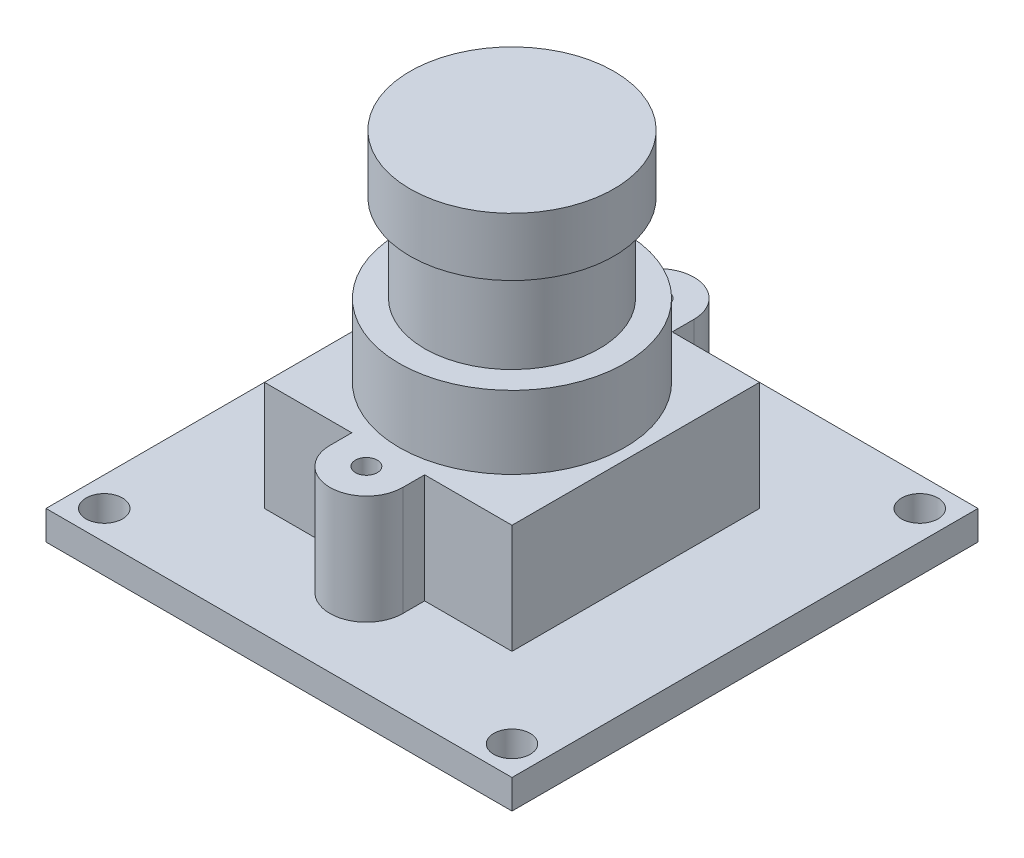
ISO-10303-21;
HEADER;
FILE_DESCRIPTION(('STEP AP214'),'2;1');
FILE_NAME('part.step','',(''),(''),'','','');
FILE_SCHEMA(('AUTOMOTIVE_DESIGN { 1 0 10303 214 1 1 1 1 }'));
ENDSEC;
DATA;
#1=APPLICATION_CONTEXT('core data for automotive mechanical design processes');
#2=APPLICATION_PROTOCOL_DEFINITION('international standard','automotive_design',2000,#1);
#3=PRODUCT_CONTEXT('',#1,'mechanical');
#4=PRODUCT('Part','Part','',(#3));
#5=PRODUCT_RELATED_PRODUCT_CATEGORY('part','',(#4));
#6=PRODUCT_DEFINITION_FORMATION('','',#4);
#7=PRODUCT_DEFINITION_CONTEXT('part definition',#1,'design');
#8=PRODUCT_DEFINITION('design','',#6,#7);
#9=PRODUCT_DEFINITION_SHAPE('','',#8);
#10=(LENGTH_UNIT() NAMED_UNIT(*) SI_UNIT(.MILLI.,.METRE.));
#11=(NAMED_UNIT(*) PLANE_ANGLE_UNIT() SI_UNIT($,.RADIAN.));
#12=(NAMED_UNIT(*) SI_UNIT($,.STERADIAN.) SOLID_ANGLE_UNIT());
#13=UNCERTAINTY_MEASURE_WITH_UNIT(LENGTH_MEASURE(1.E-05),#10,'distance_accuracy_value','');
#14=(GEOMETRIC_REPRESENTATION_CONTEXT(3) GLOBAL_UNCERTAINTY_ASSIGNED_CONTEXT((#13)) GLOBAL_UNIT_ASSIGNED_CONTEXT((#10,
#11,#12)) REPRESENTATION_CONTEXT('',''));
#15=CARTESIAN_POINT('',(0.,0.,0.));
#16=DIRECTION('',(0.,0.,1.));
#17=DIRECTION('',(1.,0.,0.));
#18=AXIS2_PLACEMENT_3D('',#15,#16,#17);
#19=CARTESIAN_POINT('',(0.,2.,0.));
#20=DIRECTION('',(0.,-1.,0.));
#21=DIRECTION('',(0.,0.,-1.));
#22=AXIS2_PLACEMENT_3D('',#19,#20,#21);
#23=PLANE('',#22);
#24=DIRECTION('',(-1.,0.,0.));
#25=VECTOR('',#24,1.);
#26=CARTESIAN_POINT('',(2.5,2.,-8.5));
#27=LINE('',#26,#25);
#28=CARTESIAN_POINT('',(8.5,2.,-8.5));
#29=VERTEX_POINT('',#28);
#30=CARTESIAN_POINT('',(2.5,2.,-8.5));
#31=VERTEX_POINT('',#30);
#32=EDGE_CURVE('E52',#29,#31,#27,.T.);
#33=ORIENTED_EDGE('',*,*,#32,.F.);
#34=DIRECTION('',(0.,0.,-1.));
#35=VECTOR('',#34,1.);
#36=CARTESIAN_POINT('',(8.5,2.,8.5));
#37=LINE('',#36,#35);
#38=CARTESIAN_POINT('',(8.5,2.,8.5));
#39=VERTEX_POINT('',#38);
#40=EDGE_CURVE('E56',#39,#29,#37,.T.);
#41=ORIENTED_EDGE('',*,*,#40,.F.);
#42=DIRECTION('',(1.,0.,0.));
#43=VECTOR('',#42,1.);
#44=CARTESIAN_POINT('',(2.5,2.,8.5));
#45=LINE('',#44,#43);
#46=CARTESIAN_POINT('',(2.5,2.,8.5));
#47=VERTEX_POINT('',#46);
#48=EDGE_CURVE('E647',#47,#39,#45,.T.);
#49=ORIENTED_EDGE('',*,*,#48,.F.);
#50=DIRECTION('',(0.,0.,-1.));
#51=VECTOR('',#50,1.);
#52=CARTESIAN_POINT('',(2.5,2.,10.));
#53=LINE('',#52,#51);
#54=CARTESIAN_POINT('',(2.5,2.,10.));
#55=VERTEX_POINT('',#54);
#56=EDGE_CURVE('E644',#55,#47,#53,.T.);
#57=ORIENTED_EDGE('',*,*,#56,.F.);
#58=CARTESIAN_POINT('',(0.,2.,10.));
#59=DIRECTION('',(0.,1.,0.));
#60=DIRECTION('',(0.,0.,1.));
#61=AXIS2_PLACEMENT_3D('',#58,#59,#60);
#62=CIRCLE('',#61,2.5);
#63=CARTESIAN_POINT('',(-2.5,2.,10.));
#64=VERTEX_POINT('',#63);
#65=EDGE_CURVE('E641',#64,#55,#62,.T.);
#66=ORIENTED_EDGE('',*,*,#65,.F.);
#67=DIRECTION('',(0.,0.,1.));
#68=VECTOR('',#67,1.);
#69=CARTESIAN_POINT('',(-2.5,2.,10.));
#70=LINE('',#69,#68);
#71=CARTESIAN_POINT('',(-2.5,2.,8.5));
#72=VERTEX_POINT('',#71);
#73=EDGE_CURVE('E638',#72,#64,#70,.T.);
#74=ORIENTED_EDGE('',*,*,#73,.F.);
#75=DIRECTION('',(1.,0.,0.));
#76=VECTOR('',#75,1.);
#77=CARTESIAN_POINT('',(-8.5,2.,8.5));
#78=LINE('',#77,#76);
#79=CARTESIAN_POINT('',(-8.5,2.,8.5));
#80=VERTEX_POINT('',#79);
#81=EDGE_CURVE('E635',#80,#72,#78,.T.);
#82=ORIENTED_EDGE('',*,*,#81,.F.);
#83=DIRECTION('',(0.,0.,1.));
#84=VECTOR('',#83,1.);
#85=CARTESIAN_POINT('',(-8.5,2.,8.5));
#86=LINE('',#85,#84);
#87=CARTESIAN_POINT('',(-8.5,2.,-8.5));
#88=VERTEX_POINT('',#87);
#89=EDGE_CURVE('E632',#88,#80,#86,.T.);
#90=ORIENTED_EDGE('',*,*,#89,.F.);
#91=DIRECTION('',(-1.,0.,0.));
#92=VECTOR('',#91,1.);
#93=CARTESIAN_POINT('',(-8.5,2.,-8.5));
#94=LINE('',#93,#92);
#95=CARTESIAN_POINT('',(-2.5,2.,-8.5));
#96=VERTEX_POINT('',#95);
#97=EDGE_CURVE('E629',#96,#88,#94,.T.);
#98=ORIENTED_EDGE('',*,*,#97,.F.);
#99=DIRECTION('',(0.,0.,1.));
#100=VECTOR('',#99,1.);
#101=CARTESIAN_POINT('',(-2.5,2.,-10.));
#102=LINE('',#101,#100);
#103=CARTESIAN_POINT('',(-2.5,2.,-10.));
#104=VERTEX_POINT('',#103);
#105=EDGE_CURVE('E626',#104,#96,#102,.T.);
#106=ORIENTED_EDGE('',*,*,#105,.F.);
#107=CARTESIAN_POINT('',(0.,2.,-10.));
#108=DIRECTION('',(0.,1.,0.));
#109=DIRECTION('',(0.,0.,1.));
#110=AXIS2_PLACEMENT_3D('',#107,#108,#109);
#111=CIRCLE('',#110,2.5);
#112=CARTESIAN_POINT('',(2.5,2.,-10.));
#113=VERTEX_POINT('',#112);
#114=EDGE_CURVE('E623',#113,#104,#111,.T.);
#115=ORIENTED_EDGE('',*,*,#114,.F.);
#116=DIRECTION('',(0.,0.,-1.));
#117=VECTOR('',#116,1.);
#118=CARTESIAN_POINT('',(2.5,2.,-10.));
#119=LINE('',#118,#117);
#120=EDGE_CURVE('E621',#31,#113,#119,.T.);
#121=ORIENTED_EDGE('',*,*,#120,.F.);
#122=EDGE_LOOP('',(#33,#41,#49,#57,#66,#74,#82,#90,#98,#106,#115,#121));
#123=FACE_BOUND('',#122,.T.);
#124=DIRECTION('',(0.,0.,-1.));
#125=VECTOR('',#124,1.);
#126=CARTESIAN_POINT('',(16.,2.,16.));
#127=LINE('',#126,#125);
#128=CARTESIAN_POINT('',(16.,2.,16.));
#129=VERTEX_POINT('',#128);
#130=CARTESIAN_POINT('',(16.,2.,-16.));
#131=VERTEX_POINT('',#130);
#132=EDGE_CURVE('E201',#129,#131,#127,.T.);
#133=ORIENTED_EDGE('',*,*,#132,.T.);
#134=DIRECTION('',(-1.,0.,0.));
#135=VECTOR('',#134,1.);
#136=CARTESIAN_POINT('',(-16.,2.,-16.));
#137=LINE('',#136,#135);
#138=CARTESIAN_POINT('',(-16.,2.,-16.));
#139=VERTEX_POINT('',#138);
#140=EDGE_CURVE('E204',#131,#139,#137,.T.);
#141=ORIENTED_EDGE('',*,*,#140,.T.);
#142=DIRECTION('',(0.,0.,1.));
#143=VECTOR('',#142,1.);
#144=CARTESIAN_POINT('',(-16.,2.,16.));
#145=LINE('',#144,#143);
#146=CARTESIAN_POINT('',(-16.,2.,16.));
#147=VERTEX_POINT('',#146);
#148=EDGE_CURVE('E207',#139,#147,#145,.T.);
#149=ORIENTED_EDGE('',*,*,#148,.T.);
#150=DIRECTION('',(1.,0.,0.));
#151=VECTOR('',#150,1.);
#152=CARTESIAN_POINT('',(-16.,2.,16.));
#153=LINE('',#152,#151);
#154=EDGE_CURVE('E209',#147,#129,#153,.T.);
#155=ORIENTED_EDGE('',*,*,#154,.T.);
#156=EDGE_LOOP('',(#133,#141,#149,#155));
#157=FACE_BOUND('',#156,.T.);
#158=CARTESIAN_POINT('',(-14.,2.,-14.));
#159=DIRECTION('',(0.,1.,0.));
#160=DIRECTION('',(0.,0.,1.));
#161=AXIS2_PLACEMENT_3D('',#158,#159,#160);
#162=CIRCLE('',#161,1.25);
#163=CARTESIAN_POINT('',(-14.,2.,-12.75));
#164=VERTEX_POINT('',#163);
#165=EDGE_CURVE('E195',#164,#164,#162,.T.);
#166=ORIENTED_EDGE('',*,*,#165,.F.);
#167=EDGE_LOOP('',(#166));
#168=FACE_BOUND('',#167,.T.);
#169=CARTESIAN_POINT('',(14.,2.,-14.));
#170=DIRECTION('',(0.,1.,0.));
#171=DIRECTION('',(0.,0.,1.));
#172=AXIS2_PLACEMENT_3D('',#169,#170,#171);
#173=CIRCLE('',#172,1.25);
#174=CARTESIAN_POINT('',(14.,2.,-12.75));
#175=VERTEX_POINT('',#174);
#176=EDGE_CURVE('E189',#175,#175,#173,.T.);
#177=ORIENTED_EDGE('',*,*,#176,.F.);
#178=EDGE_LOOP('',(#177));
#179=FACE_BOUND('',#178,.T.);
#180=CARTESIAN_POINT('',(14.,2.,14.));
#181=DIRECTION('',(0.,1.,0.));
#182=DIRECTION('',(0.,0.,1.));
#183=AXIS2_PLACEMENT_3D('',#180,#181,#182);
#184=CIRCLE('',#183,1.25);
#185=CARTESIAN_POINT('',(14.,2.,15.25));
#186=VERTEX_POINT('',#185);
#187=EDGE_CURVE('E183',#186,#186,#184,.T.);
#188=ORIENTED_EDGE('',*,*,#187,.F.);
#189=EDGE_LOOP('',(#188));
#190=FACE_BOUND('',#189,.T.);
#191=CARTESIAN_POINT('',(-14.,2.,14.));
#192=DIRECTION('',(0.,1.,0.));
#193=DIRECTION('',(0.,0.,1.));
#194=AXIS2_PLACEMENT_3D('',#191,#192,#193);
#195=CIRCLE('',#194,1.25);
#196=CARTESIAN_POINT('',(-14.,2.,15.25));
#197=VERTEX_POINT('',#196);
#198=EDGE_CURVE('E174',#197,#197,#195,.T.);
#199=ORIENTED_EDGE('',*,*,#198,.F.);
#200=EDGE_LOOP('',(#199));
#201=FACE_BOUND('',#200,.T.);
#202=ADVANCED_FACE('F36',(#123,#157,#168,#179,#190,#201),#23,.F.);
#203=CARTESIAN_POINT('',(0.,0.,0.));
#204=DIRECTION('',(0.,-1.,0.));
#205=DIRECTION('',(0.,0.,-1.));
#206=AXIS2_PLACEMENT_3D('',#203,#204,#205);
#207=PLANE('',#206);
#208=CARTESIAN_POINT('',(14.,0.,14.));
#209=DIRECTION('',(0.,1.,0.));
#210=DIRECTION('',(0.,0.,1.));
#211=AXIS2_PLACEMENT_3D('',#208,#209,#210);
#212=CIRCLE('',#211,1.25);
#213=CARTESIAN_POINT('',(14.,0.,15.25));
#214=VERTEX_POINT('',#213);
#215=EDGE_CURVE('E181',#214,#214,#212,.T.);
#216=ORIENTED_EDGE('',*,*,#215,.T.);
#217=EDGE_LOOP('',(#216));
#218=FACE_BOUND('',#217,.T.);
#219=CARTESIAN_POINT('',(-14.,0.,-14.));
#220=DIRECTION('',(0.,1.,0.));
#221=DIRECTION('',(0.,0.,1.));
#222=AXIS2_PLACEMENT_3D('',#219,#220,#221);
#223=CIRCLE('',#222,1.25);
#224=CARTESIAN_POINT('',(-14.,0.,-12.75));
#225=VERTEX_POINT('',#224);
#226=EDGE_CURVE('E192',#225,#225,#223,.T.);
#227=ORIENTED_EDGE('',*,*,#226,.T.);
#228=EDGE_LOOP('',(#227));
#229=FACE_BOUND('',#228,.T.);
#230=DIRECTION('',(0.,0.,-1.));
#231=VECTOR('',#230,1.);
#232=CARTESIAN_POINT('',(16.,0.,16.));
#233=LINE('',#232,#231);
#234=CARTESIAN_POINT('',(16.,0.,16.));
#235=VERTEX_POINT('',#234);
#236=CARTESIAN_POINT('',(16.,0.,-16.));
#237=VERTEX_POINT('',#236);
#238=EDGE_CURVE('E198',#235,#237,#233,.T.);
#239=ORIENTED_EDGE('',*,*,#238,.F.);
#240=DIRECTION('',(1.,0.,0.));
#241=VECTOR('',#240,1.);
#242=CARTESIAN_POINT('',(-16.,0.,16.));
#243=LINE('',#242,#241);
#244=CARTESIAN_POINT('',(-16.,0.,16.));
#245=VERTEX_POINT('',#244);
#246=EDGE_CURVE('E205',#245,#235,#243,.T.);
#247=ORIENTED_EDGE('',*,*,#246,.F.);
#248=DIRECTION('',(0.,0.,1.));
#249=VECTOR('',#248,1.);
#250=CARTESIAN_POINT('',(-16.,0.,16.));
#251=LINE('',#250,#249);
#252=CARTESIAN_POINT('',(-16.,0.,-16.));
#253=VERTEX_POINT('',#252);
#254=EDGE_CURVE('E216',#253,#245,#251,.T.);
#255=ORIENTED_EDGE('',*,*,#254,.F.);
#256=DIRECTION('',(-1.,0.,0.));
#257=VECTOR('',#256,1.);
#258=CARTESIAN_POINT('',(-16.,0.,-16.));
#259=LINE('',#258,#257);
#260=EDGE_CURVE('E214',#237,#253,#259,.T.);
#261=ORIENTED_EDGE('',*,*,#260,.F.);
#262=EDGE_LOOP('',(#239,#247,#255,#261));
#263=FACE_BOUND('',#262,.T.);
#264=CARTESIAN_POINT('',(14.,0.,-14.));
#265=DIRECTION('',(0.,1.,0.));
#266=DIRECTION('',(0.,0.,1.));
#267=AXIS2_PLACEMENT_3D('',#264,#265,#266);
#268=CIRCLE('',#267,1.25);
#269=CARTESIAN_POINT('',(14.,0.,-12.75));
#270=VERTEX_POINT('',#269);
#271=EDGE_CURVE('E186',#270,#270,#268,.T.);
#272=ORIENTED_EDGE('',*,*,#271,.T.);
#273=EDGE_LOOP('',(#272));
#274=FACE_BOUND('',#273,.T.);
#275=CARTESIAN_POINT('',(-14.,0.,14.));
#276=DIRECTION('',(0.,1.,0.));
#277=DIRECTION('',(0.,0.,1.));
#278=AXIS2_PLACEMENT_3D('',#275,#276,#277);
#279=CIRCLE('',#278,1.25);
#280=CARTESIAN_POINT('',(-14.,0.,15.25));
#281=VERTEX_POINT('',#280);
#282=EDGE_CURVE('E171',#281,#281,#279,.T.);
#283=ORIENTED_EDGE('',*,*,#282,.T.);
#284=EDGE_LOOP('',(#283));
#285=FACE_BOUND('',#284,.T.);
#286=ADVANCED_FACE('F239',(#218,#229,#263,#274,#285),#207,.T.);
#287=CARTESIAN_POINT('',(16.,2.,16.));
#288=DIRECTION('',(-1.,0.,0.));
#289=DIRECTION('',(0.,0.,1.));
#290=AXIS2_PLACEMENT_3D('',#287,#288,#289);
#291=PLANE('',#290);
#292=ORIENTED_EDGE('',*,*,#238,.T.);
#293=DIRECTION('',(0.,-1.,0.));
#294=VECTOR('',#293,1.);
#295=CARTESIAN_POINT('',(16.,2.,-16.));
#296=LINE('',#295,#294);
#297=EDGE_CURVE('E40',#131,#237,#296,.T.);
#298=ORIENTED_EDGE('',*,*,#297,.F.);
#299=ORIENTED_EDGE('',*,*,#132,.F.);
#300=DIRECTION('',(0.,-1.,0.));
#301=VECTOR('',#300,1.);
#302=CARTESIAN_POINT('',(16.,2.,16.));
#303=LINE('',#302,#301);
#304=EDGE_CURVE('E211',#129,#235,#303,.T.);
#305=ORIENTED_EDGE('',*,*,#304,.T.);
#306=EDGE_LOOP('',(#292,#298,#299,#305));
#307=FACE_BOUND('',#306,.T.);
#308=ADVANCED_FACE('F38',(#307),#291,.F.);
#309=CARTESIAN_POINT('',(-16.,2.,-16.));
#310=DIRECTION('',(0.,0.,1.));
#311=DIRECTION('',(1.,0.,0.));
#312=AXIS2_PLACEMENT_3D('',#309,#310,#311);
#313=PLANE('',#312);
#314=ORIENTED_EDGE('',*,*,#260,.T.);
#315=DIRECTION('',(0.,-1.,0.));
#316=VECTOR('',#315,1.);
#317=CARTESIAN_POINT('',(-16.,2.,-16.));
#318=LINE('',#317,#316);
#319=EDGE_CURVE('E223',#139,#253,#318,.T.);
#320=ORIENTED_EDGE('',*,*,#319,.F.);
#321=ORIENTED_EDGE('',*,*,#140,.F.);
#322=ORIENTED_EDGE('',*,*,#297,.T.);
#323=EDGE_LOOP('',(#314,#320,#321,#322));
#324=FACE_BOUND('',#323,.T.);
#325=ADVANCED_FACE('F232',(#324),#313,.F.);
#326=CARTESIAN_POINT('',(-16.,2.,16.));
#327=DIRECTION('',(1.,0.,0.));
#328=DIRECTION('',(0.,0.,-1.));
#329=AXIS2_PLACEMENT_3D('',#326,#327,#328);
#330=PLANE('',#329);
#331=ORIENTED_EDGE('',*,*,#254,.T.);
#332=DIRECTION('',(0.,-1.,0.));
#333=VECTOR('',#332,1.);
#334=CARTESIAN_POINT('',(-16.,2.,16.));
#335=LINE('',#334,#333);
#336=EDGE_CURVE('E221',#147,#245,#335,.T.);
#337=ORIENTED_EDGE('',*,*,#336,.F.);
#338=ORIENTED_EDGE('',*,*,#148,.F.);
#339=ORIENTED_EDGE('',*,*,#319,.T.);
#340=EDGE_LOOP('',(#331,#337,#338,#339));
#341=FACE_BOUND('',#340,.T.);
#342=ADVANCED_FACE('F242',(#341),#330,.F.);
#343=CARTESIAN_POINT('',(-16.,2.,16.));
#344=DIRECTION('',(0.,0.,-1.));
#345=DIRECTION('',(-1.,0.,0.));
#346=AXIS2_PLACEMENT_3D('',#343,#344,#345);
#347=PLANE('',#346);
#348=ORIENTED_EDGE('',*,*,#246,.T.);
#349=ORIENTED_EDGE('',*,*,#304,.F.);
#350=ORIENTED_EDGE('',*,*,#154,.F.);
#351=ORIENTED_EDGE('',*,*,#336,.T.);
#352=EDGE_LOOP('',(#348,#349,#350,#351));
#353=FACE_BOUND('',#352,.T.);
#354=ADVANCED_FACE('F245',(#353),#347,.F.);
#355=CARTESIAN_POINT('',(-14.,2.,-14.));
#356=DIRECTION('',(0.,-1.,0.));
#357=DIRECTION('',(0.,0.,-1.));
#358=AXIS2_PLACEMENT_3D('',#355,#356,#357);
#359=CYLINDRICAL_SURFACE('',#358,1.25);
#360=ORIENTED_EDGE('',*,*,#165,.T.);
#361=EDGE_LOOP('',(#360));
#362=FACE_BOUND('',#361,.T.);
#363=ORIENTED_EDGE('',*,*,#226,.F.);
#364=EDGE_LOOP('',(#363));
#365=FACE_BOUND('',#364,.T.);
#366=ADVANCED_FACE('F278',(#362,#365),#359,.F.);
#367=CARTESIAN_POINT('',(14.,2.,-14.));
#368=DIRECTION('',(0.,-1.,0.));
#369=DIRECTION('',(0.,0.,-1.));
#370=AXIS2_PLACEMENT_3D('',#367,#368,#369);
#371=CYLINDRICAL_SURFACE('',#370,1.25);
#372=ORIENTED_EDGE('',*,*,#176,.T.);
#373=EDGE_LOOP('',(#372));
#374=FACE_BOUND('',#373,.T.);
#375=ORIENTED_EDGE('',*,*,#271,.F.);
#376=EDGE_LOOP('',(#375));
#377=FACE_BOUND('',#376,.T.);
#378=ADVANCED_FACE('F299',(#374,#377),#371,.F.);
#379=CARTESIAN_POINT('',(14.,2.,14.));
#380=DIRECTION('',(0.,-1.,0.));
#381=DIRECTION('',(0.,0.,-1.));
#382=AXIS2_PLACEMENT_3D('',#379,#380,#381);
#383=CYLINDRICAL_SURFACE('',#382,1.25);
#384=ORIENTED_EDGE('',*,*,#187,.T.);
#385=EDGE_LOOP('',(#384));
#386=FACE_BOUND('',#385,.T.);
#387=ORIENTED_EDGE('',*,*,#215,.F.);
#388=EDGE_LOOP('',(#387));
#389=FACE_BOUND('',#388,.T.);
#390=ADVANCED_FACE('F263',(#386,#389),#383,.F.);
#391=CARTESIAN_POINT('',(-14.,2.,14.));
#392=DIRECTION('',(0.,-1.,0.));
#393=DIRECTION('',(0.,0.,-1.));
#394=AXIS2_PLACEMENT_3D('',#391,#392,#393);
#395=CYLINDRICAL_SURFACE('',#394,1.25);
#396=ORIENTED_EDGE('',*,*,#198,.T.);
#397=EDGE_LOOP('',(#396));
#398=FACE_BOUND('',#397,.T.);
#399=ORIENTED_EDGE('',*,*,#282,.F.);
#400=EDGE_LOOP('',(#399));
#401=FACE_BOUND('',#400,.T.);
#402=ADVANCED_FACE('F260',(#398,#401),#395,.F.);
#403=CARTESIAN_POINT('',(0.,9.5,10.));
#404=DIRECTION('',(0.,1.,0.));
#405=DIRECTION('',(0.,0.,1.));
#406=AXIS2_PLACEMENT_3D('',#403,#404,#405);
#407=PLANE('',#406);
#408=CARTESIAN_POINT('',(0.,9.5,0.));
#409=DIRECTION('',(0.,1.,0.));
#410=DIRECTION('',(0.,0.,1.));
#411=AXIS2_PLACEMENT_3D('',#408,#409,#410);
#412=CIRCLE('',#411,7.75);
#413=CARTESIAN_POINT('',(0.,9.5,7.75));
#414=VERTEX_POINT('',#413);
#415=EDGE_CURVE('E582',#414,#414,#412,.T.);
#416=ORIENTED_EDGE('',*,*,#415,.F.);
#417=EDGE_LOOP('',(#416));
#418=FACE_BOUND('',#417,.T.);
#419=CARTESIAN_POINT('',(0.,9.5,-10.));
#420=DIRECTION('',(0.,1.,0.));
#421=DIRECTION('',(0.,0.,1.));
#422=AXIS2_PLACEMENT_3D('',#419,#420,#421);
#423=CIRCLE('',#422,0.750000000000001);
#424=CARTESIAN_POINT('',(0.,9.5,-9.25));
#425=VERTEX_POINT('',#424);
#426=EDGE_CURVE('E596',#425,#425,#423,.T.);
#427=ORIENTED_EDGE('',*,*,#426,.F.);
#428=EDGE_LOOP('',(#427));
#429=FACE_BOUND('',#428,.T.);
#430=DIRECTION('',(-1.,0.,0.));
#431=VECTOR('',#430,1.);
#432=CARTESIAN_POINT('',(2.5,9.5,-8.5));
#433=LINE('',#432,#431);
#434=CARTESIAN_POINT('',(8.5,9.5,-8.5));
#435=VERTEX_POINT('',#434);
#436=CARTESIAN_POINT('',(2.5,9.5,-8.5));
#437=VERTEX_POINT('',#436);
#438=EDGE_CURVE('E159',#435,#437,#433,.T.);
#439=ORIENTED_EDGE('',*,*,#438,.T.);
#440=DIRECTION('',(0.,0.,-1.));
#441=VECTOR('',#440,1.);
#442=CARTESIAN_POINT('',(2.5,9.5,-10.));
#443=LINE('',#442,#441);
#444=CARTESIAN_POINT('',(2.5,9.5,-10.));
#445=VERTEX_POINT('',#444);
#446=EDGE_CURVE('E148',#437,#445,#443,.T.);
#447=ORIENTED_EDGE('',*,*,#446,.T.);
#448=CARTESIAN_POINT('',(0.,9.5,-10.));
#449=DIRECTION('',(0.,1.,0.));
#450=DIRECTION('',(0.,0.,1.));
#451=AXIS2_PLACEMENT_3D('',#448,#449,#450);
#452=CIRCLE('',#451,2.5);
#453=CARTESIAN_POINT('',(-2.5,9.5,-10.));
#454=VERTEX_POINT('',#453);
#455=EDGE_CURVE('E158',#445,#454,#452,.T.);
#456=ORIENTED_EDGE('',*,*,#455,.T.);
#457=DIRECTION('',(0.,0.,1.));
#458=VECTOR('',#457,1.);
#459=CARTESIAN_POINT('',(-2.5,9.5,-10.));
#460=LINE('',#459,#458);
#461=CARTESIAN_POINT('',(-2.5,9.5,-8.5));
#462=VERTEX_POINT('',#461);
#463=EDGE_CURVE('E602',#454,#462,#460,.T.);
#464=ORIENTED_EDGE('',*,*,#463,.T.);
#465=DIRECTION('',(-1.,0.,0.));
#466=VECTOR('',#465,1.);
#467=CARTESIAN_POINT('',(-8.5,9.5,-8.5));
#468=LINE('',#467,#466);
#469=CARTESIAN_POINT('',(-8.5,9.5,-8.5));
#470=VERTEX_POINT('',#469);
#471=EDGE_CURVE('E604',#462,#470,#468,.T.);
#472=ORIENTED_EDGE('',*,*,#471,.T.);
#473=DIRECTION('',(0.,0.,1.));
#474=VECTOR('',#473,1.);
#475=CARTESIAN_POINT('',(-8.5,9.5,8.5));
#476=LINE('',#475,#474);
#477=CARTESIAN_POINT('',(-8.5,9.5,8.5));
#478=VERTEX_POINT('',#477);
#479=EDGE_CURVE('E606',#470,#478,#476,.T.);
#480=ORIENTED_EDGE('',*,*,#479,.T.);
#481=DIRECTION('',(1.,0.,0.));
#482=VECTOR('',#481,1.);
#483=CARTESIAN_POINT('',(-8.5,9.5,8.5));
#484=LINE('',#483,#482);
#485=CARTESIAN_POINT('',(-2.5,9.5,8.5));
#486=VERTEX_POINT('',#485);
#487=EDGE_CURVE('E608',#478,#486,#484,.T.);
#488=ORIENTED_EDGE('',*,*,#487,.T.);
#489=DIRECTION('',(0.,0.,1.));
#490=VECTOR('',#489,1.);
#491=CARTESIAN_POINT('',(-2.5,9.5,10.));
#492=LINE('',#491,#490);
#493=CARTESIAN_POINT('',(-2.5,9.5,10.));
#494=VERTEX_POINT('',#493);
#495=EDGE_CURVE('E610',#486,#494,#492,.T.);
#496=ORIENTED_EDGE('',*,*,#495,.T.);
#497=CARTESIAN_POINT('',(0.,9.5,10.));
#498=DIRECTION('',(0.,1.,0.));
#499=DIRECTION('',(0.,0.,1.));
#500=AXIS2_PLACEMENT_3D('',#497,#498,#499);
#501=CIRCLE('',#500,2.5);
#502=CARTESIAN_POINT('',(2.5,9.5,10.));
#503=VERTEX_POINT('',#502);
#504=EDGE_CURVE('E612',#494,#503,#501,.T.);
#505=ORIENTED_EDGE('',*,*,#504,.T.);
#506=DIRECTION('',(0.,0.,-1.));
#507=VECTOR('',#506,1.);
#508=CARTESIAN_POINT('',(2.5,9.5,10.));
#509=LINE('',#508,#507);
#510=CARTESIAN_POINT('',(2.5,9.5,8.5));
#511=VERTEX_POINT('',#510);
#512=EDGE_CURVE('E614',#503,#511,#509,.T.);
#513=ORIENTED_EDGE('',*,*,#512,.T.);
#514=DIRECTION('',(1.,0.,0.));
#515=VECTOR('',#514,1.);
#516=CARTESIAN_POINT('',(2.5,9.5,8.5));
#517=LINE('',#516,#515);
#518=CARTESIAN_POINT('',(8.5,9.5,8.5));
#519=VERTEX_POINT('',#518);
#520=EDGE_CURVE('E616',#511,#519,#517,.T.);
#521=ORIENTED_EDGE('',*,*,#520,.T.);
#522=DIRECTION('',(0.,0.,-1.));
#523=VECTOR('',#522,1.);
#524=CARTESIAN_POINT('',(8.5,9.5,8.5));
#525=LINE('',#524,#523);
#526=EDGE_CURVE('E165',#519,#435,#525,.T.);
#527=ORIENTED_EDGE('',*,*,#526,.T.);
#528=EDGE_LOOP('',(#439,#447,#456,#464,#472,#480,#488,#496,#505,#513,#521,#527));
#529=FACE_BOUND('',#528,.T.);
#530=CARTESIAN_POINT('',(0.,9.5,10.));
#531=DIRECTION('',(0.,1.,0.));
#532=DIRECTION('',(0.,0.,1.));
#533=AXIS2_PLACEMENT_3D('',#530,#531,#532);
#534=CIRCLE('',#533,0.75);
#535=CARTESIAN_POINT('',(0.,9.5,10.75));
#536=VERTEX_POINT('',#535);
#537=EDGE_CURVE('E590',#536,#536,#534,.T.);
#538=ORIENTED_EDGE('',*,*,#537,.F.);
#539=EDGE_LOOP('',(#538));
#540=FACE_BOUND('',#539,.T.);
#541=ADVANCED_FACE('F162',(#418,#429,#529,#540),#407,.T.);
#542=CARTESIAN_POINT('',(2.5,9.5,-8.5));
#543=DIRECTION('',(0.,0.,1.));
#544=DIRECTION('',(1.,0.,0.));
#545=AXIS2_PLACEMENT_3D('',#542,#543,#544);
#546=PLANE('',#545);
#547=ORIENTED_EDGE('',*,*,#32,.T.);
#548=DIRECTION('',(0.,-1.,0.));
#549=VECTOR('',#548,1.);
#550=CARTESIAN_POINT('',(2.5,9.5,-8.5));
#551=LINE('',#550,#549);
#552=EDGE_CURVE('E153',#437,#31,#551,.T.);
#553=ORIENTED_EDGE('',*,*,#552,.F.);
#554=ORIENTED_EDGE('',*,*,#438,.F.);
#555=DIRECTION('',(0.,-1.,0.));
#556=VECTOR('',#555,1.);
#557=CARTESIAN_POINT('',(8.5,9.5,-8.5));
#558=LINE('',#557,#556);
#559=EDGE_CURVE('E619',#435,#29,#558,.T.);
#560=ORIENTED_EDGE('',*,*,#559,.T.);
#561=EDGE_LOOP('',(#547,#553,#554,#560));
#562=FACE_BOUND('',#561,.T.);
#563=ADVANCED_FACE('F170',(#562),#546,.F.);
#564=CARTESIAN_POINT('',(2.5,9.5,-10.));
#565=DIRECTION('',(-1.,0.,0.));
#566=DIRECTION('',(0.,0.,1.));
#567=AXIS2_PLACEMENT_3D('',#564,#565,#566);
#568=PLANE('',#567);
#569=ORIENTED_EDGE('',*,*,#120,.T.);
#570=DIRECTION('',(0.,-1.,0.));
#571=VECTOR('',#570,1.);
#572=CARTESIAN_POINT('',(2.5,9.5,-10.));
#573=LINE('',#572,#571);
#574=EDGE_CURVE('E155',#445,#113,#573,.T.);
#575=ORIENTED_EDGE('',*,*,#574,.F.);
#576=ORIENTED_EDGE('',*,*,#446,.F.);
#577=ORIENTED_EDGE('',*,*,#552,.T.);
#578=EDGE_LOOP('',(#569,#575,#576,#577));
#579=FACE_BOUND('',#578,.T.);
#580=ADVANCED_FACE('F151',(#579),#568,.F.);
#581=CARTESIAN_POINT('',(0.,9.5,-10.));
#582=DIRECTION('',(0.,-1.,0.));
#583=DIRECTION('',(0.,0.,-1.));
#584=AXIS2_PLACEMENT_3D('',#581,#582,#583);
#585=CYLINDRICAL_SURFACE('',#584,2.5);
#586=ORIENTED_EDGE('',*,*,#114,.T.);
#587=DIRECTION('',(0.,-1.,0.));
#588=VECTOR('',#587,1.);
#589=CARTESIAN_POINT('',(-2.5,9.5,-10.));
#590=LINE('',#589,#588);
#591=EDGE_CURVE('E176',#454,#104,#590,.T.);
#592=ORIENTED_EDGE('',*,*,#591,.F.);
#593=ORIENTED_EDGE('',*,*,#455,.F.);
#594=ORIENTED_EDGE('',*,*,#574,.T.);
#595=EDGE_LOOP('',(#586,#592,#593,#594));
#596=FACE_BOUND('',#595,.T.);
#597=ADVANCED_FACE('F340',(#596),#585,.T.);
#598=CARTESIAN_POINT('',(-2.5,9.5,-10.));
#599=DIRECTION('',(1.,0.,0.));
#600=DIRECTION('',(0.,0.,-1.));
#601=AXIS2_PLACEMENT_3D('',#598,#599,#600);
#602=PLANE('',#601);
#603=ORIENTED_EDGE('',*,*,#105,.T.);
#604=DIRECTION('',(0.,-1.,0.));
#605=VECTOR('',#604,1.);
#606=CARTESIAN_POINT('',(-2.5,9.5,-8.5));
#607=LINE('',#606,#605);
#608=EDGE_CURVE('E672',#462,#96,#607,.T.);
#609=ORIENTED_EDGE('',*,*,#608,.F.);
#610=ORIENTED_EDGE('',*,*,#463,.F.);
#611=ORIENTED_EDGE('',*,*,#591,.T.);
#612=EDGE_LOOP('',(#603,#609,#610,#611));
#613=FACE_BOUND('',#612,.T.);
#614=ADVANCED_FACE('F347',(#613),#602,.F.);
#615=CARTESIAN_POINT('',(-8.5,9.5,-8.5));
#616=DIRECTION('',(0.,0.,1.));
#617=DIRECTION('',(1.,0.,0.));
#618=AXIS2_PLACEMENT_3D('',#615,#616,#617);
#619=PLANE('',#618);
#620=ORIENTED_EDGE('',*,*,#97,.T.);
#621=DIRECTION('',(0.,-1.,0.));
#622=VECTOR('',#621,1.);
#623=CARTESIAN_POINT('',(-8.5,9.5,-8.5));
#624=LINE('',#623,#622);
#625=EDGE_CURVE('E669',#470,#88,#624,.T.);
#626=ORIENTED_EDGE('',*,*,#625,.F.);
#627=ORIENTED_EDGE('',*,*,#471,.F.);
#628=ORIENTED_EDGE('',*,*,#608,.T.);
#629=EDGE_LOOP('',(#620,#626,#627,#628));
#630=FACE_BOUND('',#629,.T.);
#631=ADVANCED_FACE('F355',(#630),#619,.F.);
#632=CARTESIAN_POINT('',(-8.5,9.5,8.5));
#633=DIRECTION('',(1.,0.,0.));
#634=DIRECTION('',(0.,0.,-1.));
#635=AXIS2_PLACEMENT_3D('',#632,#633,#634);
#636=PLANE('',#635);
#637=ORIENTED_EDGE('',*,*,#89,.T.);
#638=DIRECTION('',(0.,-1.,0.));
#639=VECTOR('',#638,1.);
#640=CARTESIAN_POINT('',(-8.5,9.5,8.5));
#641=LINE('',#640,#639);
#642=EDGE_CURVE('E666',#478,#80,#641,.T.);
#643=ORIENTED_EDGE('',*,*,#642,.F.);
#644=ORIENTED_EDGE('',*,*,#479,.F.);
#645=ORIENTED_EDGE('',*,*,#625,.T.);
#646=EDGE_LOOP('',(#637,#643,#644,#645));
#647=FACE_BOUND('',#646,.T.);
#648=ADVANCED_FACE('F363',(#647),#636,.F.);
#649=CARTESIAN_POINT('',(-8.5,9.5,8.5));
#650=DIRECTION('',(0.,0.,-1.));
#651=DIRECTION('',(-1.,0.,0.));
#652=AXIS2_PLACEMENT_3D('',#649,#650,#651);
#653=PLANE('',#652);
#654=ORIENTED_EDGE('',*,*,#81,.T.);
#655=DIRECTION('',(0.,-1.,0.));
#656=VECTOR('',#655,1.);
#657=CARTESIAN_POINT('',(-2.5,9.5,8.5));
#658=LINE('',#657,#656);
#659=EDGE_CURVE('E663',#486,#72,#658,.T.);
#660=ORIENTED_EDGE('',*,*,#659,.F.);
#661=ORIENTED_EDGE('',*,*,#487,.F.);
#662=ORIENTED_EDGE('',*,*,#642,.T.);
#663=EDGE_LOOP('',(#654,#660,#661,#662));
#664=FACE_BOUND('',#663,.T.);
#665=ADVANCED_FACE('F371',(#664),#653,.F.);
#666=CARTESIAN_POINT('',(-2.5,9.5,10.));
#667=DIRECTION('',(1.,0.,0.));
#668=DIRECTION('',(0.,0.,-1.));
#669=AXIS2_PLACEMENT_3D('',#666,#667,#668);
#670=PLANE('',#669);
#671=ORIENTED_EDGE('',*,*,#73,.T.);
#672=DIRECTION('',(0.,-1.,0.));
#673=VECTOR('',#672,1.);
#674=CARTESIAN_POINT('',(-2.5,9.5,10.));
#675=LINE('',#674,#673);
#676=EDGE_CURVE('E660',#494,#64,#675,.T.);
#677=ORIENTED_EDGE('',*,*,#676,.F.);
#678=ORIENTED_EDGE('',*,*,#495,.F.);
#679=ORIENTED_EDGE('',*,*,#659,.T.);
#680=EDGE_LOOP('',(#671,#677,#678,#679));
#681=FACE_BOUND('',#680,.T.);
#682=ADVANCED_FACE('F379',(#681),#670,.F.);
#683=CARTESIAN_POINT('',(0.,9.5,10.));
#684=DIRECTION('',(0.,-1.,0.));
#685=DIRECTION('',(0.,0.,-1.));
#686=AXIS2_PLACEMENT_3D('',#683,#684,#685);
#687=CYLINDRICAL_SURFACE('',#686,2.5);
#688=ORIENTED_EDGE('',*,*,#65,.T.);
#689=DIRECTION('',(0.,-1.,0.));
#690=VECTOR('',#689,1.);
#691=CARTESIAN_POINT('',(2.5,9.5,10.));
#692=LINE('',#691,#690);
#693=EDGE_CURVE('E657',#503,#55,#692,.T.);
#694=ORIENTED_EDGE('',*,*,#693,.F.);
#695=ORIENTED_EDGE('',*,*,#504,.F.);
#696=ORIENTED_EDGE('',*,*,#676,.T.);
#697=EDGE_LOOP('',(#688,#694,#695,#696));
#698=FACE_BOUND('',#697,.T.);
#699=ADVANCED_FACE('F387',(#698),#687,.T.);
#700=CARTESIAN_POINT('',(2.5,9.5,10.));
#701=DIRECTION('',(-1.,0.,0.));
#702=DIRECTION('',(0.,0.,1.));
#703=AXIS2_PLACEMENT_3D('',#700,#701,#702);
#704=PLANE('',#703);
#705=ORIENTED_EDGE('',*,*,#56,.T.);
#706=DIRECTION('',(0.,-1.,0.));
#707=VECTOR('',#706,1.);
#708=CARTESIAN_POINT('',(2.5,9.5,8.5));
#709=LINE('',#708,#707);
#710=EDGE_CURVE('E654',#511,#47,#709,.T.);
#711=ORIENTED_EDGE('',*,*,#710,.F.);
#712=ORIENTED_EDGE('',*,*,#512,.F.);
#713=ORIENTED_EDGE('',*,*,#693,.T.);
#714=EDGE_LOOP('',(#705,#711,#712,#713));
#715=FACE_BOUND('',#714,.T.);
#716=ADVANCED_FACE('F395',(#715),#704,.F.);
#717=CARTESIAN_POINT('',(2.5,9.5,8.5));
#718=DIRECTION('',(0.,0.,-1.));
#719=DIRECTION('',(-1.,0.,0.));
#720=AXIS2_PLACEMENT_3D('',#717,#718,#719);
#721=PLANE('',#720);
#722=ORIENTED_EDGE('',*,*,#48,.T.);
#723=DIRECTION('',(0.,-1.,0.));
#724=VECTOR('',#723,1.);
#725=CARTESIAN_POINT('',(8.5,9.5,8.5));
#726=LINE('',#725,#724);
#727=EDGE_CURVE('E651',#519,#39,#726,.T.);
#728=ORIENTED_EDGE('',*,*,#727,.F.);
#729=ORIENTED_EDGE('',*,*,#520,.F.);
#730=ORIENTED_EDGE('',*,*,#710,.T.);
#731=EDGE_LOOP('',(#722,#728,#729,#730));
#732=FACE_BOUND('',#731,.T.);
#733=ADVANCED_FACE('F403',(#732),#721,.F.);
#734=CARTESIAN_POINT('',(8.5,9.5,8.5));
#735=DIRECTION('',(-1.,0.,0.));
#736=DIRECTION('',(0.,0.,1.));
#737=AXIS2_PLACEMENT_3D('',#734,#735,#736);
#738=PLANE('',#737);
#739=ORIENTED_EDGE('',*,*,#40,.T.);
#740=ORIENTED_EDGE('',*,*,#559,.F.);
#741=ORIENTED_EDGE('',*,*,#526,.F.);
#742=ORIENTED_EDGE('',*,*,#727,.T.);
#743=EDGE_LOOP('',(#739,#740,#741,#742));
#744=FACE_BOUND('',#743,.T.);
#745=ADVANCED_FACE('F411',(#744),#738,.F.);
#746=CARTESIAN_POINT('',(0.,9.5,-10.));
#747=DIRECTION('',(0.,-1.,0.));
#748=DIRECTION('',(0.,0.,-1.));
#749=AXIS2_PLACEMENT_3D('',#746,#747,#748);
#750=CYLINDRICAL_SURFACE('',#749,0.750000000000001);
#751=ORIENTED_EDGE('',*,*,#426,.T.);
#752=EDGE_LOOP('',(#751));
#753=FACE_BOUND('',#752,.T.);
#754=CARTESIAN_POINT('',(0.,2.,-10.));
#755=DIRECTION('',(0.,1.,0.));
#756=DIRECTION('',(0.,0.,1.));
#757=AXIS2_PLACEMENT_3D('',#754,#755,#756);
#758=CIRCLE('',#757,0.750000000000001);
#759=CARTESIAN_POINT('',(0.,2.,-9.25));
#760=VERTEX_POINT('',#759);
#761=EDGE_CURVE('E593',#760,#760,#758,.T.);
#762=ORIENTED_EDGE('',*,*,#761,.F.);
#763=EDGE_LOOP('',(#762));
#764=FACE_BOUND('',#763,.T.);
#765=ADVANCED_FACE('F419',(#753,#764),#750,.F.);
#766=CARTESIAN_POINT('',(0.,9.5,10.));
#767=DIRECTION('',(0.,-1.,0.));
#768=DIRECTION('',(0.,0.,-1.));
#769=AXIS2_PLACEMENT_3D('',#766,#767,#768);
#770=CYLINDRICAL_SURFACE('',#769,0.75);
#771=ORIENTED_EDGE('',*,*,#537,.T.);
#772=EDGE_LOOP('',(#771));
#773=FACE_BOUND('',#772,.T.);
#774=CARTESIAN_POINT('',(0.,2.,10.));
#775=DIRECTION('',(0.,1.,0.));
#776=DIRECTION('',(0.,0.,1.));
#777=AXIS2_PLACEMENT_3D('',#774,#775,#776);
#778=CIRCLE('',#777,0.75);
#779=CARTESIAN_POINT('',(0.,2.,10.75));
#780=VERTEX_POINT('',#779);
#781=EDGE_CURVE('E587',#780,#780,#778,.T.);
#782=ORIENTED_EDGE('',*,*,#781,.F.);
#783=EDGE_LOOP('',(#782));
#784=FACE_BOUND('',#783,.T.);
#785=ADVANCED_FACE('F427',(#773,#784),#770,.F.);
#786=ORIENTED_EDGE('',*,*,#761,.T.);
#787=EDGE_LOOP('',(#786));
#788=FACE_BOUND('',#787,.T.);
#789=ADVANCED_FACE('F250',(#788),#23,.F.);
#790=ORIENTED_EDGE('',*,*,#781,.T.);
#791=EDGE_LOOP('',(#790));
#792=FACE_BOUND('',#791,.T.);
#793=ADVANCED_FACE('F251',(#792),#23,.F.);
#794=CARTESIAN_POINT('',(0.,14.5,0.));
#795=DIRECTION('',(0.,-1.,0.));
#796=DIRECTION('',(0.,0.,-1.));
#797=AXIS2_PLACEMENT_3D('',#794,#795,#796);
#798=CYLINDRICAL_SURFACE('',#797,7.75);
#799=CARTESIAN_POINT('',(0.,14.5,0.));
#800=DIRECTION('',(0.,1.,0.));
#801=DIRECTION('',(0.,0.,1.));
#802=AXIS2_PLACEMENT_3D('',#799,#800,#801);
#803=CIRCLE('',#802,7.75);
#804=CARTESIAN_POINT('',(0.,14.5,7.75));
#805=VERTEX_POINT('',#804);
#806=EDGE_CURVE('E584',#805,#805,#803,.T.);
#807=ORIENTED_EDGE('',*,*,#806,.F.);
#808=EDGE_LOOP('',(#807));
#809=FACE_BOUND('',#808,.T.);
#810=ORIENTED_EDGE('',*,*,#415,.T.);
#811=EDGE_LOOP('',(#810));
#812=FACE_BOUND('',#811,.T.);
#813=ADVANCED_FACE('F447',(#809,#812),#798,.T.);
#814=CARTESIAN_POINT('',(0.,14.5,0.));
#815=DIRECTION('',(0.,1.,0.));
#816=DIRECTION('',(0.,0.,1.));
#817=AXIS2_PLACEMENT_3D('',#814,#815,#816);
#818=PLANE('',#817);
#819=CARTESIAN_POINT('',(0.,14.5,0.));
#820=DIRECTION('',(0.,1.,0.));
#821=DIRECTION('',(0.,0.,1.));
#822=AXIS2_PLACEMENT_3D('',#819,#820,#821);
#823=CIRCLE('',#822,6.);
#824=CARTESIAN_POINT('',(0.,14.5,6.));
#825=VERTEX_POINT('',#824);
#826=EDGE_CURVE('E11',#825,#825,#823,.T.);
#827=ORIENTED_EDGE('',*,*,#826,.F.);
#828=EDGE_LOOP('',(#827));
#829=FACE_BOUND('',#828,.T.);
#830=ORIENTED_EDGE('',*,*,#806,.T.);
#831=EDGE_LOOP('',(#830));
#832=FACE_BOUND('',#831,.T.);
#833=ADVANCED_FACE('F453',(#829,#832),#818,.T.);
#834=CARTESIAN_POINT('',(0.,20.5,0.));
#835=DIRECTION('',(0.,-1.,0.));
#836=DIRECTION('',(0.,0.,-1.));
#837=AXIS2_PLACEMENT_3D('',#834,#835,#836);
#838=CYLINDRICAL_SURFACE('',#837,6.);
#839=CARTESIAN_POINT('',(0.,20.5,0.));
#840=DIRECTION('',(0.,1.,0.));
#841=DIRECTION('',(0.,0.,1.));
#842=AXIS2_PLACEMENT_3D('',#839,#840,#841);
#843=CIRCLE('',#842,6.);
#844=CARTESIAN_POINT('',(0.,20.5,6.));
#845=VERTEX_POINT('',#844);
#846=EDGE_CURVE('E572',#845,#845,#843,.T.);
#847=ORIENTED_EDGE('',*,*,#846,.F.);
#848=EDGE_LOOP('',(#847));
#849=FACE_BOUND('',#848,.T.);
#850=ORIENTED_EDGE('',*,*,#826,.T.);
#851=EDGE_LOOP('',(#850));
#852=FACE_BOUND('',#851,.T.);
#853=ADVANCED_FACE('F461',(#849,#852),#838,.T.);
#854=CARTESIAN_POINT('',(0.,24.5,0.));
#855=DIRECTION('',(0.,-1.,0.));
#856=DIRECTION('',(0.,0.,-1.));
#857=AXIS2_PLACEMENT_3D('',#854,#855,#856);
#858=CYLINDRICAL_SURFACE('',#857,7.);
#859=CARTESIAN_POINT('',(0.,24.5,0.));
#860=DIRECTION('',(0.,1.,0.));
#861=DIRECTION('',(0.,0.,1.));
#862=AXIS2_PLACEMENT_3D('',#859,#860,#861);
#863=CIRCLE('',#862,7.);
#864=CARTESIAN_POINT('',(0.,24.5,7.));
#865=VERTEX_POINT('',#864);
#866=EDGE_CURVE('E577',#865,#865,#863,.T.);
#867=ORIENTED_EDGE('',*,*,#866,.F.);
#868=EDGE_LOOP('',(#867));
#869=FACE_BOUND('',#868,.T.);
#870=CARTESIAN_POINT('',(0.,20.5,0.));
#871=DIRECTION('',(0.,1.,0.));
#872=DIRECTION('',(0.,0.,1.));
#873=AXIS2_PLACEMENT_3D('',#870,#871,#872);
#874=CIRCLE('',#873,7.);
#875=CARTESIAN_POINT('',(0.,20.5,7.));
#876=VERTEX_POINT('',#875);
#877=EDGE_CURVE('E575',#876,#876,#874,.T.);
#878=ORIENTED_EDGE('',*,*,#877,.T.);
#879=EDGE_LOOP('',(#878));
#880=FACE_BOUND('',#879,.T.);
#881=ADVANCED_FACE('F469',(#869,#880),#858,.T.);
#882=CARTESIAN_POINT('',(0.,24.5,0.));
#883=DIRECTION('',(0.,1.,0.));
#884=DIRECTION('',(0.,0.,1.));
#885=AXIS2_PLACEMENT_3D('',#882,#883,#884);
#886=PLANE('',#885);
#887=ORIENTED_EDGE('',*,*,#866,.T.);
#888=EDGE_LOOP('',(#887));
#889=FACE_BOUND('',#888,.T.);
#890=ADVANCED_FACE('F477',(#889),#886,.T.);
#891=CARTESIAN_POINT('',(0.,20.5,0.));
#892=DIRECTION('',(0.,1.,0.));
#893=DIRECTION('',(0.,0.,1.));
#894=AXIS2_PLACEMENT_3D('',#891,#892,#893);
#895=PLANE('',#894);
#896=ORIENTED_EDGE('',*,*,#846,.T.);
#897=EDGE_LOOP('',(#896));
#898=FACE_BOUND('',#897,.T.);
#899=ORIENTED_EDGE('',*,*,#877,.F.);
#900=EDGE_LOOP('',(#899));
#901=FACE_BOUND('',#900,.T.);
#902=ADVANCED_FACE('F485',(#898,#901),#895,.F.);
#903=CLOSED_SHELL('',(#202,#286,#308,#325,#342,#354,#366,#378,#390,#402,#541,#563,#580,#597,
#614,#631,#648,#665,#682,#699,#716,#733,#745,#765,#785,#789,#793,#813,#833,#853,#881,#890,#902));
#904=MANIFOLD_SOLID_BREP('B2',#903);
#905=ADVANCED_BREP_SHAPE_REPRESENTATION('',(#18,#904),#14);
#906=SHAPE_DEFINITION_REPRESENTATION(#9,#905);
ENDSEC;
END-ISO-10303-21;
